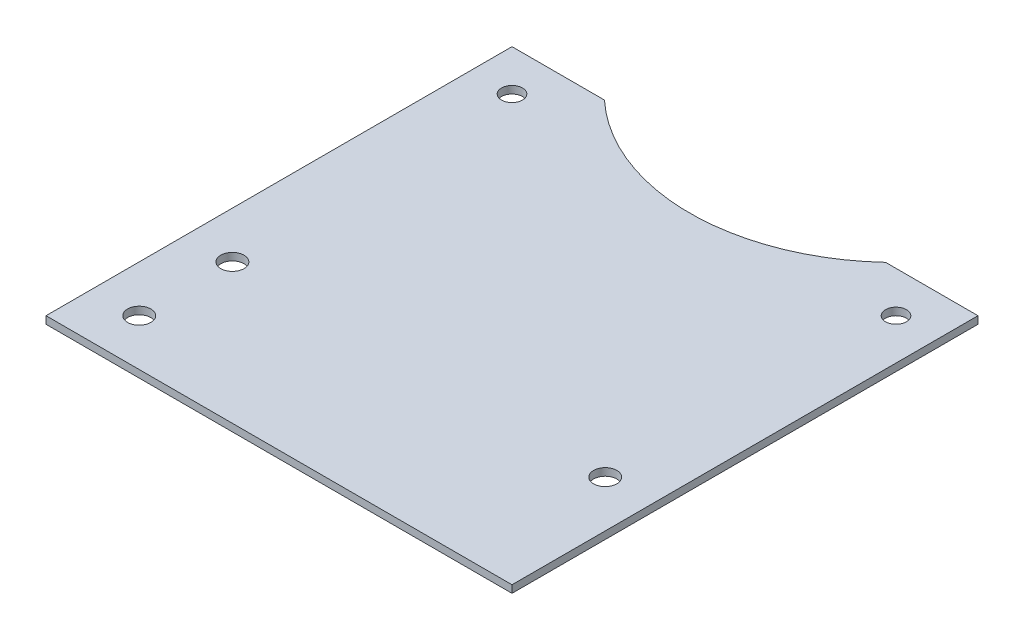
ISO-10303-21;
HEADER;
FILE_DESCRIPTION(('STEP AP214'),'2;1');
FILE_NAME('part.step','',(''),(''),'','','');
FILE_SCHEMA(('AUTOMOTIVE_DESIGN { 1 0 10303 214 1 1 1 1 }'));
ENDSEC;
DATA;
#1=APPLICATION_CONTEXT('core data for automotive mechanical design processes');
#2=APPLICATION_PROTOCOL_DEFINITION('international standard','automotive_design',2000,#1);
#3=PRODUCT_CONTEXT('',#1,'mechanical');
#4=PRODUCT('Part','Part','',(#3));
#5=PRODUCT_RELATED_PRODUCT_CATEGORY('part','',(#4));
#6=PRODUCT_DEFINITION_FORMATION('','',#4);
#7=PRODUCT_DEFINITION_CONTEXT('part definition',#1,'design');
#8=PRODUCT_DEFINITION('design','',#6,#7);
#9=PRODUCT_DEFINITION_SHAPE('','',#8);
#10=(LENGTH_UNIT() NAMED_UNIT(*) SI_UNIT(.MILLI.,.METRE.));
#11=(NAMED_UNIT(*) PLANE_ANGLE_UNIT() SI_UNIT($,.RADIAN.));
#12=(NAMED_UNIT(*) SI_UNIT($,.STERADIAN.) SOLID_ANGLE_UNIT());
#13=UNCERTAINTY_MEASURE_WITH_UNIT(LENGTH_MEASURE(1.E-05),#10,'distance_accuracy_value','');
#14=(GEOMETRIC_REPRESENTATION_CONTEXT(3) GLOBAL_UNCERTAINTY_ASSIGNED_CONTEXT((#13)) GLOBAL_UNIT_ASSIGNED_CONTEXT((#10,
#11,#12)) REPRESENTATION_CONTEXT('',''));
#15=CARTESIAN_POINT('',(0.,0.,0.));
#16=DIRECTION('',(0.,0.,1.));
#17=DIRECTION('',(1.,0.,0.));
#18=AXIS2_PLACEMENT_3D('',#15,#16,#17);
#19=CARTESIAN_POINT('',(-50.,0.8,-50.));
#20=DIRECTION('',(0.,0.,1.));
#21=DIRECTION('',(1.,0.,0.));
#22=AXIS2_PLACEMENT_3D('',#19,#20,#21);
#23=PLANE('',#22);
#24=DIRECTION('',(-1.,0.,0.));
#25=VECTOR('',#24,1.);
#26=CARTESIAN_POINT('',(-50.,-0.8,-50.));
#27=LINE('',#26,#25);
#28=CARTESIAN_POINT('',(50.,-0.8,-50.));
#29=VERTEX_POINT('',#28);
#30=CARTESIAN_POINT('',(30.1684669812704,-0.8,-50.));
#31=VERTEX_POINT('',#30);
#32=EDGE_CURVE('E99',#29,#31,#27,.T.);
#33=ORIENTED_EDGE('',*,*,#32,.T.);
#34=DIRECTION('',(0.,1.,0.));
#35=VECTOR('',#34,1.);
#36=CARTESIAN_POINT('',(30.1684669812704,-0.8,-50.));
#37=LINE('',#36,#35);
#38=CARTESIAN_POINT('',(30.1684669812704,0.8,-50.));
#39=VERTEX_POINT('',#38);
#40=EDGE_CURVE('E11',#31,#39,#37,.T.);
#41=ORIENTED_EDGE('',*,*,#40,.T.);
#42=DIRECTION('',(-1.,0.,0.));
#43=VECTOR('',#42,1.);
#44=CARTESIAN_POINT('',(-50.,0.8,-50.));
#45=LINE('',#44,#43);
#46=CARTESIAN_POINT('',(50.,0.8,-50.));
#47=VERTEX_POINT('',#46);
#48=EDGE_CURVE('E85',#47,#39,#45,.T.);
#49=ORIENTED_EDGE('',*,*,#48,.F.);
#50=DIRECTION('',(0.,-1.,0.));
#51=VECTOR('',#50,1.);
#52=CARTESIAN_POINT('',(50.,0.8,-50.));
#53=LINE('',#52,#51);
#54=EDGE_CURVE('E129',#47,#29,#53,.T.);
#55=ORIENTED_EDGE('',*,*,#54,.T.);
#56=EDGE_LOOP('',(#33,#41,#49,#55));
#57=FACE_BOUND('',#56,.T.);
#58=ADVANCED_FACE('F33',(#57),#23,.F.);
#59=CARTESIAN_POINT('',(0.,0.8,0.));
#60=DIRECTION('',(0.,-1.,0.));
#61=DIRECTION('',(0.,0.,-1.));
#62=AXIS2_PLACEMENT_3D('',#59,#60,#61);
#63=PLANE('',#62);
#64=ORIENTED_EDGE('',*,*,#48,.T.);
#65=CARTESIAN_POINT('',(0.,0.8,-82.44));
#66=DIRECTION('',(0.,1.,0.));
#67=DIRECTION('',(0.,0.,1.));
#68=AXIS2_PLACEMENT_3D('',#65,#66,#67);
#69=CIRCLE('',#68,44.3);
#70=CARTESIAN_POINT('',(-30.1684669812704,0.8,-50.));
#71=VERTEX_POINT('',#70);
#72=EDGE_CURVE('E94',#71,#39,#69,.T.);
#73=ORIENTED_EDGE('',*,*,#72,.F.);
#74=CARTESIAN_POINT('',(-50.,0.8,-50.));
#75=VERTEX_POINT('',#74);
#76=EDGE_CURVE('E106',#71,#75,#45,.T.);
#77=ORIENTED_EDGE('',*,*,#76,.T.);
#78=DIRECTION('',(0.,0.,1.));
#79=VECTOR('',#78,1.);
#80=CARTESIAN_POINT('',(-50.,0.8,50.));
#81=LINE('',#80,#79);
#82=CARTESIAN_POINT('',(-50.,0.8,50.));
#83=VERTEX_POINT('',#82);
#84=EDGE_CURVE('E105',#75,#83,#81,.T.);
#85=ORIENTED_EDGE('',*,*,#84,.T.);
#86=DIRECTION('',(1.,0.,0.));
#87=VECTOR('',#86,1.);
#88=CARTESIAN_POINT('',(-50.,0.8,50.));
#89=LINE('',#88,#87);
#90=CARTESIAN_POINT('',(50.,0.8,50.));
#91=VERTEX_POINT('',#90);
#92=EDGE_CURVE('E57',#83,#91,#89,.T.);
#93=ORIENTED_EDGE('',*,*,#92,.T.);
#94=DIRECTION('',(0.,0.,-1.));
#95=VECTOR('',#94,1.);
#96=CARTESIAN_POINT('',(50.,0.8,50.));
#97=LINE('',#96,#95);
#98=EDGE_CURVE('E103',#91,#47,#97,.T.);
#99=ORIENTED_EDGE('',*,*,#98,.T.);
#100=EDGE_LOOP('',(#64,#73,#77,#85,#93,#99));
#101=FACE_BOUND('',#100,.T.);
#102=CARTESIAN_POINT('',(-40.,0.8,40.));
#103=DIRECTION('',(0.,1.,0.));
#104=DIRECTION('',(0.,0.,1.));
#105=AXIS2_PLACEMENT_3D('',#102,#103,#104);
#106=CIRCLE('',#105,2.5);
#107=CARTESIAN_POINT('',(-40.,0.8,42.5));
#108=VERTEX_POINT('',#107);
#109=EDGE_CURVE('E118',#108,#108,#106,.T.);
#110=ORIENTED_EDGE('',*,*,#109,.F.);
#111=EDGE_LOOP('',(#110));
#112=FACE_BOUND('',#111,.T.);
#113=CARTESIAN_POINT('',(-40.,0.8,20.));
#114=DIRECTION('',(0.,1.,0.));
#115=DIRECTION('',(0.,0.,1.));
#116=AXIS2_PLACEMENT_3D('',#113,#114,#115);
#117=CIRCLE('',#116,2.5);
#118=CARTESIAN_POINT('',(-40.,0.8,22.5));
#119=VERTEX_POINT('',#118);
#120=EDGE_CURVE('E281',#119,#119,#117,.T.);
#121=ORIENTED_EDGE('',*,*,#120,.F.);
#122=EDGE_LOOP('',(#121));
#123=FACE_BOUND('',#122,.T.);
#124=CARTESIAN_POINT('',(40.,0.8,20.));
#125=DIRECTION('',(0.,1.,0.));
#126=DIRECTION('',(0.,0.,1.));
#127=AXIS2_PLACEMENT_3D('',#124,#125,#126);
#128=CIRCLE('',#127,2.5);
#129=CARTESIAN_POINT('',(40.,0.8,22.5));
#130=VERTEX_POINT('',#129);
#131=EDGE_CURVE('E275',#130,#130,#128,.T.);
#132=ORIENTED_EDGE('',*,*,#131,.F.);
#133=EDGE_LOOP('',(#132));
#134=FACE_BOUND('',#133,.T.);
#135=CARTESIAN_POINT('',(-41.2,0.8,-41.2));
#136=DIRECTION('',(0.,1.,0.));
#137=DIRECTION('',(0.,0.,1.));
#138=AXIS2_PLACEMENT_3D('',#135,#136,#137);
#139=CIRCLE('',#138,2.25);
#140=CARTESIAN_POINT('',(-41.2,0.8,-38.95));
#141=VERTEX_POINT('',#140);
#142=EDGE_CURVE('E269',#141,#141,#139,.T.);
#143=ORIENTED_EDGE('',*,*,#142,.F.);
#144=EDGE_LOOP('',(#143));
#145=FACE_BOUND('',#144,.T.);
#146=CARTESIAN_POINT('',(41.2,0.8,-41.2));
#147=DIRECTION('',(0.,1.,0.));
#148=DIRECTION('',(0.,0.,1.));
#149=AXIS2_PLACEMENT_3D('',#146,#147,#148);
#150=CIRCLE('',#149,2.25);
#151=CARTESIAN_POINT('',(41.2,0.8,-38.95));
#152=VERTEX_POINT('',#151);
#153=EDGE_CURVE('E259',#152,#152,#150,.T.);
#154=ORIENTED_EDGE('',*,*,#153,.F.);
#155=EDGE_LOOP('',(#154));
#156=FACE_BOUND('',#155,.T.);
#157=ADVANCED_FACE('F100',(#101,#112,#123,#134,#145,#156),#63,.F.);
#158=CARTESIAN_POINT('',(0.,-0.8,0.));
#159=DIRECTION('',(0.,-1.,0.));
#160=DIRECTION('',(0.,0.,-1.));
#161=AXIS2_PLACEMENT_3D('',#158,#159,#160);
#162=PLANE('',#161);
#163=CARTESIAN_POINT('',(0.,-0.8,-82.44));
#164=DIRECTION('',(0.,1.,0.));
#165=DIRECTION('',(0.,0.,1.));
#166=AXIS2_PLACEMENT_3D('',#163,#164,#165);
#167=CIRCLE('',#166,44.3);
#168=CARTESIAN_POINT('',(-30.1684669812704,-0.8,-50.));
#169=VERTEX_POINT('',#168);
#170=EDGE_CURVE('E48',#169,#31,#167,.T.);
#171=ORIENTED_EDGE('',*,*,#170,.T.);
#172=ORIENTED_EDGE('',*,*,#32,.F.);
#173=DIRECTION('',(0.,0.,-1.));
#174=VECTOR('',#173,1.);
#175=CARTESIAN_POINT('',(50.,-0.8,50.));
#176=LINE('',#175,#174);
#177=CARTESIAN_POINT('',(50.,-0.8,50.));
#178=VERTEX_POINT('',#177);
#179=EDGE_CURVE('E114',#178,#29,#176,.T.);
#180=ORIENTED_EDGE('',*,*,#179,.F.);
#181=DIRECTION('',(1.,0.,0.));
#182=VECTOR('',#181,1.);
#183=CARTESIAN_POINT('',(-50.,-0.8,50.));
#184=LINE('',#183,#182);
#185=CARTESIAN_POINT('',(-50.,-0.8,50.));
#186=VERTEX_POINT('',#185);
#187=EDGE_CURVE('E78',#186,#178,#184,.T.);
#188=ORIENTED_EDGE('',*,*,#187,.F.);
#189=DIRECTION('',(0.,0.,1.));
#190=VECTOR('',#189,1.);
#191=CARTESIAN_POINT('',(-50.,-0.8,50.));
#192=LINE('',#191,#190);
#193=CARTESIAN_POINT('',(-50.,-0.8,-50.));
#194=VERTEX_POINT('',#193);
#195=EDGE_CURVE('E120',#194,#186,#192,.T.);
#196=ORIENTED_EDGE('',*,*,#195,.F.);
#197=EDGE_CURVE('E117',#169,#194,#27,.T.);
#198=ORIENTED_EDGE('',*,*,#197,.F.);
#199=EDGE_LOOP('',(#171,#172,#180,#188,#196,#198));
#200=FACE_BOUND('',#199,.T.);
#201=CARTESIAN_POINT('',(-41.2,-0.8,-41.2));
#202=DIRECTION('',(0.,1.,0.));
#203=DIRECTION('',(0.,0.,1.));
#204=AXIS2_PLACEMENT_3D('',#201,#202,#203);
#205=CIRCLE('',#204,2.25);
#206=CARTESIAN_POINT('',(-41.2,-0.8,-38.95));
#207=VERTEX_POINT('',#206);
#208=EDGE_CURVE('E265',#207,#207,#205,.T.);
#209=ORIENTED_EDGE('',*,*,#208,.T.);
#210=EDGE_LOOP('',(#209));
#211=FACE_BOUND('',#210,.T.);
#212=CARTESIAN_POINT('',(-40.,-0.8,20.));
#213=DIRECTION('',(0.,1.,0.));
#214=DIRECTION('',(0.,0.,1.));
#215=AXIS2_PLACEMENT_3D('',#212,#213,#214);
#216=CIRCLE('',#215,2.5);
#217=CARTESIAN_POINT('',(-40.,-0.8,22.5));
#218=VERTEX_POINT('',#217);
#219=EDGE_CURVE('E278',#218,#218,#216,.T.);
#220=ORIENTED_EDGE('',*,*,#219,.T.);
#221=EDGE_LOOP('',(#220));
#222=FACE_BOUND('',#221,.T.);
#223=CARTESIAN_POINT('',(-40.,-0.8,40.));
#224=DIRECTION('',(0.,1.,0.));
#225=DIRECTION('',(0.,0.,1.));
#226=AXIS2_PLACEMENT_3D('',#223,#224,#225);
#227=CIRCLE('',#226,2.5);
#228=CARTESIAN_POINT('',(-40.,-0.8,42.5));
#229=VERTEX_POINT('',#228);
#230=EDGE_CURVE('E284',#229,#229,#227,.T.);
#231=ORIENTED_EDGE('',*,*,#230,.T.);
#232=EDGE_LOOP('',(#231));
#233=FACE_BOUND('',#232,.T.);
#234=CARTESIAN_POINT('',(40.,-0.8,20.));
#235=DIRECTION('',(0.,1.,0.));
#236=DIRECTION('',(0.,0.,1.));
#237=AXIS2_PLACEMENT_3D('',#234,#235,#236);
#238=CIRCLE('',#237,2.5);
#239=CARTESIAN_POINT('',(40.,-0.8,22.5));
#240=VERTEX_POINT('',#239);
#241=EDGE_CURVE('E272',#240,#240,#238,.T.);
#242=ORIENTED_EDGE('',*,*,#241,.T.);
#243=EDGE_LOOP('',(#242));
#244=FACE_BOUND('',#243,.T.);
#245=CARTESIAN_POINT('',(41.2,-0.8,-41.2));
#246=DIRECTION('',(0.,1.,0.));
#247=DIRECTION('',(0.,0.,1.));
#248=AXIS2_PLACEMENT_3D('',#245,#246,#247);
#249=CIRCLE('',#248,2.25);
#250=CARTESIAN_POINT('',(41.2,-0.8,-38.95));
#251=VERTEX_POINT('',#250);
#252=EDGE_CURVE('E262',#251,#251,#249,.T.);
#253=ORIENTED_EDGE('',*,*,#252,.T.);
#254=EDGE_LOOP('',(#253));
#255=FACE_BOUND('',#254,.T.);
#256=ADVANCED_FACE('F136',(#200,#211,#222,#233,#244,#255),#162,.T.);
#257=CARTESIAN_POINT('',(50.,0.8,50.));
#258=DIRECTION('',(-1.,0.,0.));
#259=DIRECTION('',(0.,0.,1.));
#260=AXIS2_PLACEMENT_3D('',#257,#258,#259);
#261=PLANE('',#260);
#262=ORIENTED_EDGE('',*,*,#179,.T.);
#263=ORIENTED_EDGE('',*,*,#54,.F.);
#264=ORIENTED_EDGE('',*,*,#98,.F.);
#265=DIRECTION('',(0.,-1.,0.));
#266=VECTOR('',#265,1.);
#267=CARTESIAN_POINT('',(50.,0.8,50.));
#268=LINE('',#267,#266);
#269=EDGE_CURVE('E113',#91,#178,#268,.T.);
#270=ORIENTED_EDGE('',*,*,#269,.T.);
#271=EDGE_LOOP('',(#262,#263,#264,#270));
#272=FACE_BOUND('',#271,.T.);
#273=ADVANCED_FACE('F35',(#272),#261,.F.);
#274=ORIENTED_EDGE('',*,*,#76,.F.);
#275=DIRECTION('',(0.,1.,0.));
#276=VECTOR('',#275,1.);
#277=CARTESIAN_POINT('',(-30.1684669812704,-0.8,-50.));
#278=LINE('',#277,#276);
#279=EDGE_CURVE('E41',#71,#169,#278,.F.);
#280=ORIENTED_EDGE('',*,*,#279,.T.);
#281=ORIENTED_EDGE('',*,*,#197,.T.);
#282=DIRECTION('',(0.,-1.,0.));
#283=VECTOR('',#282,1.);
#284=CARTESIAN_POINT('',(-50.,0.8,-50.));
#285=LINE('',#284,#283);
#286=EDGE_CURVE('E126',#75,#194,#285,.T.);
#287=ORIENTED_EDGE('',*,*,#286,.F.);
#288=EDGE_LOOP('',(#274,#280,#281,#287));
#289=FACE_BOUND('',#288,.T.);
#290=ADVANCED_FACE('F132',(#289),#23,.F.);
#291=CARTESIAN_POINT('',(-50.,0.8,50.));
#292=DIRECTION('',(1.,0.,0.));
#293=DIRECTION('',(0.,0.,-1.));
#294=AXIS2_PLACEMENT_3D('',#291,#292,#293);
#295=PLANE('',#294);
#296=ORIENTED_EDGE('',*,*,#195,.T.);
#297=DIRECTION('',(0.,-1.,0.));
#298=VECTOR('',#297,1.);
#299=CARTESIAN_POINT('',(-50.,0.8,50.));
#300=LINE('',#299,#298);
#301=EDGE_CURVE('E124',#83,#186,#300,.T.);
#302=ORIENTED_EDGE('',*,*,#301,.F.);
#303=ORIENTED_EDGE('',*,*,#84,.F.);
#304=ORIENTED_EDGE('',*,*,#286,.T.);
#305=EDGE_LOOP('',(#296,#302,#303,#304));
#306=FACE_BOUND('',#305,.T.);
#307=ADVANCED_FACE('F141',(#306),#295,.F.);
#308=CARTESIAN_POINT('',(-50.,0.8,50.));
#309=DIRECTION('',(0.,0.,-1.));
#310=DIRECTION('',(-1.,0.,0.));
#311=AXIS2_PLACEMENT_3D('',#308,#309,#310);
#312=PLANE('',#311);
#313=ORIENTED_EDGE('',*,*,#187,.T.);
#314=ORIENTED_EDGE('',*,*,#269,.F.);
#315=ORIENTED_EDGE('',*,*,#92,.F.);
#316=ORIENTED_EDGE('',*,*,#301,.T.);
#317=EDGE_LOOP('',(#313,#314,#315,#316));
#318=FACE_BOUND('',#317,.T.);
#319=ADVANCED_FACE('F143',(#318),#312,.F.);
#320=CARTESIAN_POINT('',(-40.,0.8,40.));
#321=DIRECTION('',(0.,-1.,0.));
#322=DIRECTION('',(0.,0.,-1.));
#323=AXIS2_PLACEMENT_3D('',#320,#321,#322);
#324=CYLINDRICAL_SURFACE('',#323,2.5);
#325=ORIENTED_EDGE('',*,*,#109,.T.);
#326=EDGE_LOOP('',(#325));
#327=FACE_BOUND('',#326,.T.);
#328=ORIENTED_EDGE('',*,*,#230,.F.);
#329=EDGE_LOOP('',(#328));
#330=FACE_BOUND('',#329,.T.);
#331=ADVANCED_FACE('F163',(#327,#330),#324,.F.);
#332=CARTESIAN_POINT('',(-40.,0.8,20.));
#333=DIRECTION('',(0.,-1.,0.));
#334=DIRECTION('',(0.,0.,-1.));
#335=AXIS2_PLACEMENT_3D('',#332,#333,#334);
#336=CYLINDRICAL_SURFACE('',#335,2.5);
#337=ORIENTED_EDGE('',*,*,#120,.T.);
#338=EDGE_LOOP('',(#337));
#339=FACE_BOUND('',#338,.T.);
#340=ORIENTED_EDGE('',*,*,#219,.F.);
#341=EDGE_LOOP('',(#340));
#342=FACE_BOUND('',#341,.T.);
#343=ADVANCED_FACE('F167',(#339,#342),#336,.F.);
#344=CARTESIAN_POINT('',(40.,0.8,20.));
#345=DIRECTION('',(0.,-1.,0.));
#346=DIRECTION('',(0.,0.,-1.));
#347=AXIS2_PLACEMENT_3D('',#344,#345,#346);
#348=CYLINDRICAL_SURFACE('',#347,2.5);
#349=ORIENTED_EDGE('',*,*,#131,.T.);
#350=EDGE_LOOP('',(#349));
#351=FACE_BOUND('',#350,.T.);
#352=ORIENTED_EDGE('',*,*,#241,.F.);
#353=EDGE_LOOP('',(#352));
#354=FACE_BOUND('',#353,.T.);
#355=ADVANCED_FACE('F171',(#351,#354),#348,.F.);
#356=CARTESIAN_POINT('',(-41.2,0.8,-41.2));
#357=DIRECTION('',(0.,-1.,0.));
#358=DIRECTION('',(0.,0.,-1.));
#359=AXIS2_PLACEMENT_3D('',#356,#357,#358);
#360=CYLINDRICAL_SURFACE('',#359,2.25);
#361=ORIENTED_EDGE('',*,*,#142,.T.);
#362=EDGE_LOOP('',(#361));
#363=FACE_BOUND('',#362,.T.);
#364=ORIENTED_EDGE('',*,*,#208,.F.);
#365=EDGE_LOOP('',(#364));
#366=FACE_BOUND('',#365,.T.);
#367=ADVANCED_FACE('F175',(#363,#366),#360,.F.);
#368=CARTESIAN_POINT('',(41.2,0.8,-41.2));
#369=DIRECTION('',(0.,-1.,0.));
#370=DIRECTION('',(0.,0.,-1.));
#371=AXIS2_PLACEMENT_3D('',#368,#369,#370);
#372=CYLINDRICAL_SURFACE('',#371,2.25);
#373=ORIENTED_EDGE('',*,*,#153,.T.);
#374=EDGE_LOOP('',(#373));
#375=FACE_BOUND('',#374,.T.);
#376=ORIENTED_EDGE('',*,*,#252,.F.);
#377=EDGE_LOOP('',(#376));
#378=FACE_BOUND('',#377,.T.);
#379=ADVANCED_FACE('F179',(#375,#378),#372,.F.);
#380=CARTESIAN_POINT('',(0.,-0.8,-82.44));
#381=DIRECTION('',(0.,1.,0.));
#382=DIRECTION('',(0.,0.,1.));
#383=AXIS2_PLACEMENT_3D('',#380,#381,#382);
#384=CYLINDRICAL_SURFACE('',#383,44.3);
#385=ORIENTED_EDGE('',*,*,#170,.F.);
#386=ORIENTED_EDGE('',*,*,#279,.F.);
#387=ORIENTED_EDGE('',*,*,#72,.T.);
#388=ORIENTED_EDGE('',*,*,#40,.F.);
#389=EDGE_LOOP('',(#385,#386,#387,#388));
#390=FACE_BOUND('',#389,.T.);
#391=ADVANCED_FACE('F95',(#390),#384,.F.);
#392=CLOSED_SHELL('',(#58,#157,#256,#273,#290,#307,#319,#331,#343,#355,#367,#379,#391));
#393=MANIFOLD_SOLID_BREP('B2',#392);
#394=ADVANCED_BREP_SHAPE_REPRESENTATION('',(#18,#393),#14);
#395=SHAPE_DEFINITION_REPRESENTATION(#9,#394);
ENDSEC;
END-ISO-10303-21;
